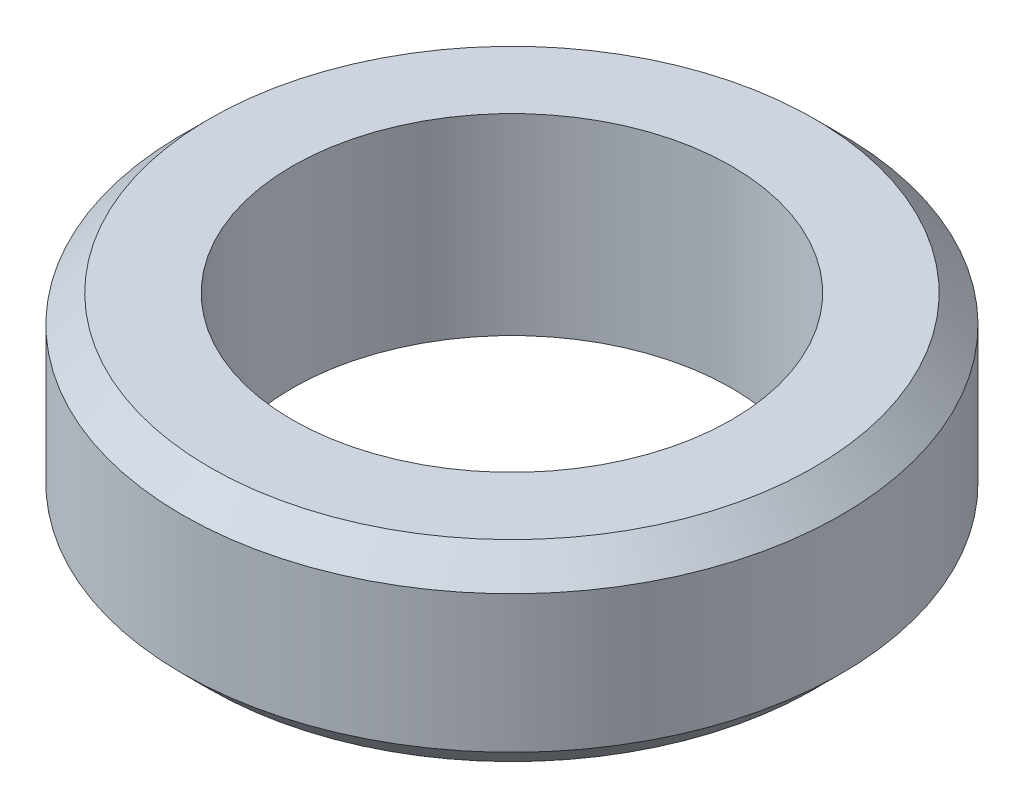
ISO-10303-21;
HEADER;
FILE_DESCRIPTION(('STEP AP214'),'2;1');
FILE_NAME('part.step','',(''),(''),'','','');
FILE_SCHEMA(('AUTOMOTIVE_DESIGN { 1 0 10303 214 1 1 1 1 }'));
ENDSEC;
DATA;
#1=APPLICATION_CONTEXT('core data for automotive mechanical design processes');
#2=APPLICATION_PROTOCOL_DEFINITION('international standard','automotive_design',2000,#1);
#3=PRODUCT_CONTEXT('',#1,'mechanical');
#4=PRODUCT('Part','Part','',(#3));
#5=PRODUCT_RELATED_PRODUCT_CATEGORY('part','',(#4));
#6=PRODUCT_DEFINITION_FORMATION('','',#4);
#7=PRODUCT_DEFINITION_CONTEXT('part definition',#1,'design');
#8=PRODUCT_DEFINITION('design','',#6,#7);
#9=PRODUCT_DEFINITION_SHAPE('','',#8);
#10=(LENGTH_UNIT() NAMED_UNIT(*) SI_UNIT(.MILLI.,.METRE.));
#11=(NAMED_UNIT(*) PLANE_ANGLE_UNIT() SI_UNIT($,.RADIAN.));
#12=(NAMED_UNIT(*) SI_UNIT($,.STERADIAN.) SOLID_ANGLE_UNIT());
#13=UNCERTAINTY_MEASURE_WITH_UNIT(LENGTH_MEASURE(1.E-05),#10,'distance_accuracy_value','');
#14=(GEOMETRIC_REPRESENTATION_CONTEXT(3) GLOBAL_UNCERTAINTY_ASSIGNED_CONTEXT((#13)) GLOBAL_UNIT_ASSIGNED_CONTEXT((#10,
#11,#12)) REPRESENTATION_CONTEXT('',''));
#15=CARTESIAN_POINT('',(0.,0.,0.));
#16=DIRECTION('',(0.,0.,1.));
#17=DIRECTION('',(1.,0.,0.));
#18=AXIS2_PLACEMENT_3D('',#15,#16,#17);
#19=CARTESIAN_POINT('',(0.,3.5,0.));
#20=DIRECTION('',(0.,1.,0.));
#21=DIRECTION('',(0.,0.,1.));
#22=AXIS2_PLACEMENT_3D('',#19,#20,#21);
#23=PLANE('',#22);
#24=CARTESIAN_POINT('',(0.,3.5,0.));
#25=DIRECTION('',(0.,1.,0.));
#26=DIRECTION('',(0.,0.,1.));
#27=AXIS2_PLACEMENT_3D('',#24,#25,#26);
#28=CIRCLE('',#27,5.50000000000001);
#29=CARTESIAN_POINT('',(0.,3.5,5.50000000000001));
#30=VERTEX_POINT('',#29);
#31=EDGE_CURVE('E10',#30,#30,#28,.T.);
#32=ORIENTED_EDGE('',*,*,#31,.T.);
#33=EDGE_LOOP('',(#32));
#34=FACE_BOUND('',#33,.T.);
#35=CARTESIAN_POINT('',(0.,3.5,0.));
#36=DIRECTION('',(0.,1.,0.));
#37=DIRECTION('',(0.,0.,1.));
#38=AXIS2_PLACEMENT_3D('',#35,#36,#37);
#39=CIRCLE('',#38,4.);
#40=CARTESIAN_POINT('',(0.,3.5,4.));
#41=VERTEX_POINT('',#40);
#42=EDGE_CURVE('E62',#41,#41,#39,.T.);
#43=ORIENTED_EDGE('',*,*,#42,.F.);
#44=EDGE_LOOP('',(#43));
#45=FACE_BOUND('',#44,.T.);
#46=ADVANCED_FACE('F41',(#34,#45),#23,.T.);
#47=CARTESIAN_POINT('',(0.,0.,0.));
#48=DIRECTION('',(0.,1.,0.));
#49=DIRECTION('',(0.,0.,1.));
#50=AXIS2_PLACEMENT_3D('',#47,#48,#49);
#51=PLANE('',#50);
#52=CARTESIAN_POINT('',(0.,0.,0.));
#53=DIRECTION('',(0.,1.,0.));
#54=DIRECTION('',(0.,0.,1.));
#55=AXIS2_PLACEMENT_3D('',#52,#53,#54);
#56=CIRCLE('',#55,5.5);
#57=CARTESIAN_POINT('',(0.,0.,5.5));
#58=VERTEX_POINT('',#57);
#59=EDGE_CURVE('E49',#58,#58,#56,.F.);
#60=ORIENTED_EDGE('',*,*,#59,.T.);
#61=EDGE_LOOP('',(#60));
#62=FACE_BOUND('',#61,.T.);
#63=CARTESIAN_POINT('',(0.,0.,0.));
#64=DIRECTION('',(0.,1.,0.));
#65=DIRECTION('',(0.,0.,1.));
#66=AXIS2_PLACEMENT_3D('',#63,#64,#65);
#67=CIRCLE('',#66,4.);
#68=CARTESIAN_POINT('',(0.,0.,4.));
#69=VERTEX_POINT('',#68);
#70=EDGE_CURVE('E63',#69,#69,#67,.T.);
#71=ORIENTED_EDGE('',*,*,#70,.T.);
#72=EDGE_LOOP('',(#71));
#73=FACE_BOUND('',#72,.T.);
#74=ADVANCED_FACE('F73',(#62,#73),#51,.F.);
#75=CARTESIAN_POINT('',(0.,3.5,0.));
#76=DIRECTION('',(0.,-1.,0.));
#77=DIRECTION('',(0.,0.,-1.));
#78=AXIS2_PLACEMENT_3D('',#75,#76,#77);
#79=CYLINDRICAL_SURFACE('',#78,6.);
#80=CARTESIAN_POINT('',(0.,0.499999999999999,0.));
#81=DIRECTION('',(0.,1.,0.));
#82=DIRECTION('',(0.,0.,1.));
#83=AXIS2_PLACEMENT_3D('',#80,#81,#82);
#84=CIRCLE('',#83,6.);
#85=CARTESIAN_POINT('',(0.,0.499999999999999,6.));
#86=VERTEX_POINT('',#85);
#87=EDGE_CURVE('E53',#86,#86,#84,.T.);
#88=ORIENTED_EDGE('',*,*,#87,.T.);
#89=EDGE_LOOP('',(#88));
#90=FACE_BOUND('',#89,.T.);
#91=CARTESIAN_POINT('',(0.,3.,0.));
#92=DIRECTION('',(0.,1.,0.));
#93=DIRECTION('',(0.,0.,1.));
#94=AXIS2_PLACEMENT_3D('',#91,#92,#93);
#95=CIRCLE('',#94,6.);
#96=CARTESIAN_POINT('',(0.,3.,6.));
#97=VERTEX_POINT('',#96);
#98=EDGE_CURVE('E57',#97,#97,#95,.F.);
#99=ORIENTED_EDGE('',*,*,#98,.T.);
#100=EDGE_LOOP('',(#99));
#101=FACE_BOUND('',#100,.T.);
#102=ADVANCED_FACE('F79',(#90,#101),#79,.T.);
#103=CARTESIAN_POINT('',(0.,3.5,0.));
#104=DIRECTION('',(0.,-1.,0.));
#105=DIRECTION('',(0.,0.,-1.));
#106=AXIS2_PLACEMENT_3D('',#103,#104,#105);
#107=CYLINDRICAL_SURFACE('',#106,4.);
#108=ORIENTED_EDGE('',*,*,#42,.T.);
#109=EDGE_LOOP('',(#108));
#110=FACE_BOUND('',#109,.T.);
#111=ORIENTED_EDGE('',*,*,#70,.F.);
#112=EDGE_LOOP('',(#111));
#113=FACE_BOUND('',#112,.T.);
#114=ADVANCED_FACE('F69',(#110,#113),#107,.F.);
#115=CARTESIAN_POINT('',(0.,0.499999999999999,0.));
#116=DIRECTION('',(0.,1.,0.));
#117=DIRECTION('',(0.,0.,1.));
#118=AXIS2_PLACEMENT_3D('',#115,#116,#117);
#119=CONICAL_SURFACE('',#118,6.,0.78539816339745);
#120=ORIENTED_EDGE('',*,*,#59,.F.);
#121=EDGE_LOOP('',(#120));
#122=FACE_BOUND('',#121,.T.);
#123=ORIENTED_EDGE('',*,*,#87,.F.);
#124=EDGE_LOOP('',(#123));
#125=FACE_BOUND('',#124,.T.);
#126=ADVANCED_FACE('F86',(#122,#125),#119,.T.);
#127=CARTESIAN_POINT('',(0.,3.5,0.));
#128=DIRECTION('',(0.,-1.,0.));
#129=DIRECTION('',(0.,0.,-1.));
#130=AXIS2_PLACEMENT_3D('',#127,#128,#129);
#131=CONICAL_SURFACE('',#130,5.50000000000001,0.785398163397447);
#132=ORIENTED_EDGE('',*,*,#98,.F.);
#133=EDGE_LOOP('',(#132));
#134=FACE_BOUND('',#133,.T.);
#135=ORIENTED_EDGE('',*,*,#31,.F.);
#136=EDGE_LOOP('',(#135));
#137=FACE_BOUND('',#136,.T.);
#138=ADVANCED_FACE('F44',(#134,#137),#131,.T.);
#139=CLOSED_SHELL('',(#46,#74,#102,#114,#126,#138));
#140=MANIFOLD_SOLID_BREP('B2',#139);
#141=ADVANCED_BREP_SHAPE_REPRESENTATION('',(#18,#140),#14);
#142=SHAPE_DEFINITION_REPRESENTATION(#9,#141);
ENDSEC;
END-ISO-10303-21;
